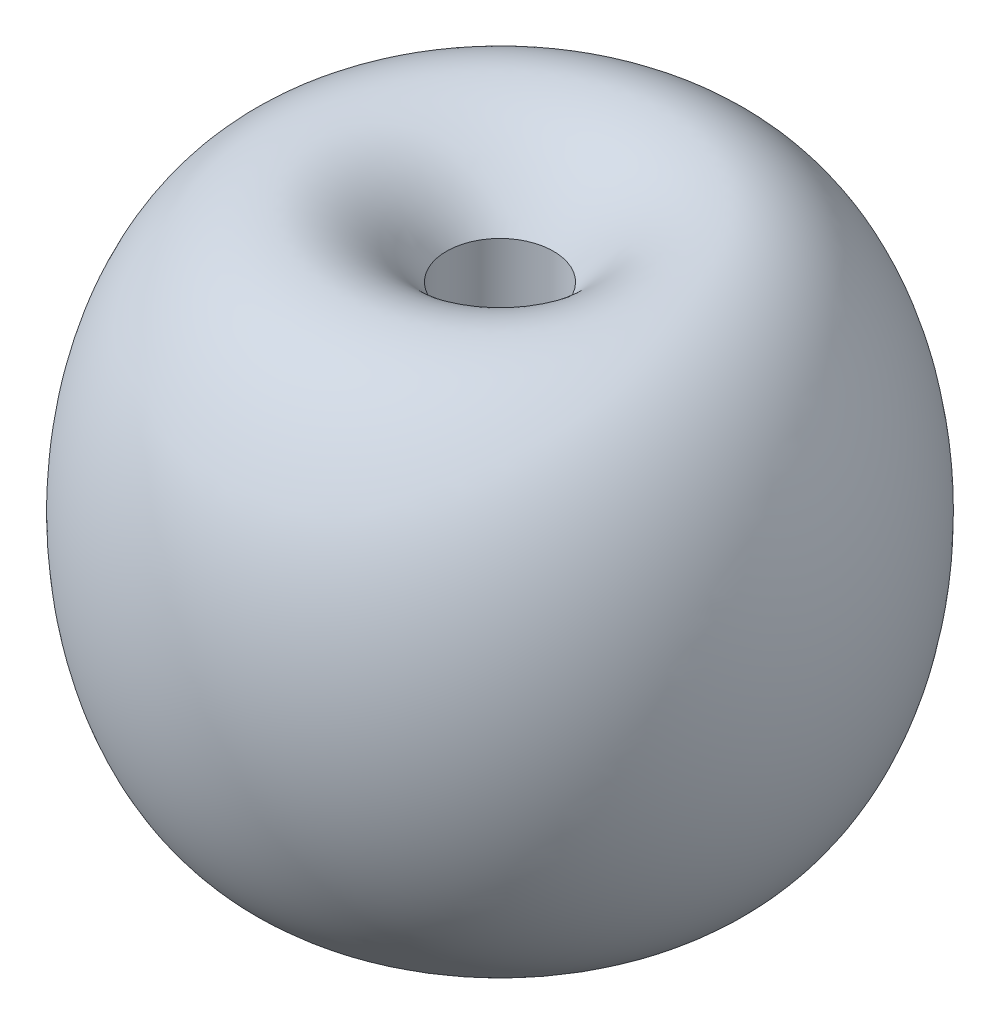
ISO-10303-21;
HEADER;
FILE_DESCRIPTION(('STEP AP214'),'2;1');
FILE_NAME('part.step','',(''),(''),'','','');
FILE_SCHEMA(('AUTOMOTIVE_DESIGN { 1 0 10303 214 1 1 1 1 }'));
ENDSEC;
DATA;
#1=APPLICATION_CONTEXT('core data for automotive mechanical design processes');
#2=APPLICATION_PROTOCOL_DEFINITION('international standard','automotive_design',2000,#1);
#3=PRODUCT_CONTEXT('',#1,'mechanical');
#4=PRODUCT('Part','Part','',(#3));
#5=PRODUCT_RELATED_PRODUCT_CATEGORY('part','',(#4));
#6=PRODUCT_DEFINITION_FORMATION('','',#4);
#7=PRODUCT_DEFINITION_CONTEXT('part definition',#1,'design');
#8=PRODUCT_DEFINITION('design','',#6,#7);
#9=PRODUCT_DEFINITION_SHAPE('','',#8);
#10=(LENGTH_UNIT() NAMED_UNIT(*) SI_UNIT(.MILLI.,.METRE.));
#11=(NAMED_UNIT(*) PLANE_ANGLE_UNIT() SI_UNIT($,.RADIAN.));
#12=(NAMED_UNIT(*) SI_UNIT($,.STERADIAN.) SOLID_ANGLE_UNIT());
#13=UNCERTAINTY_MEASURE_WITH_UNIT(LENGTH_MEASURE(1.E-05),#10,'distance_accuracy_value','');
#14=(GEOMETRIC_REPRESENTATION_CONTEXT(3) GLOBAL_UNCERTAINTY_ASSIGNED_CONTEXT((#13)) GLOBAL_UNIT_ASSIGNED_CONTEXT((#10,
#11,#12)) REPRESENTATION_CONTEXT('',''));
#15=CARTESIAN_POINT('',(0.,0.,0.));
#16=DIRECTION('',(0.,0.,1.));
#17=DIRECTION('',(1.,0.,0.));
#18=AXIS2_PLACEMENT_3D('',#15,#16,#17);
#19=CARTESIAN_POINT('',(0.,30.,0.));
#20=DIRECTION('',(0.,1.,0.));
#21=DIRECTION('',(0.,0.,1.));
#22=AXIS2_PLACEMENT_3D('',#19,#20,#21);
#23=CYLINDRICAL_SURFACE('',#22,5.);
#24=CARTESIAN_POINT('',(0.,-18.6338998124982,0.));
#25=DIRECTION('',(0.,1.,0.));
#26=DIRECTION('',(0.,0.,1.));
#27=AXIS2_PLACEMENT_3D('',#24,#25,#26);
#28=CIRCLE('',#27,5.);
#29=CARTESIAN_POINT('',(0.,-18.6338998124982,5.));
#30=VERTEX_POINT('',#29);
#31=EDGE_CURVE('E49',#30,#30,#28,.T.);
#32=ORIENTED_EDGE('',*,*,#31,.F.);
#33=EDGE_LOOP('',(#32));
#34=FACE_BOUND('',#33,.T.);
#35=CARTESIAN_POINT('',(0.,18.6338998124982,0.));
#36=DIRECTION('',(0.,1.,0.));
#37=DIRECTION('',(0.,0.,1.));
#38=AXIS2_PLACEMENT_3D('',#35,#36,#37);
#39=CIRCLE('',#38,5.);
#40=CARTESIAN_POINT('',(0.,18.6338998124982,5.));
#41=VERTEX_POINT('',#40);
#42=EDGE_CURVE('E10',#41,#41,#39,.T.);
#43=ORIENTED_EDGE('',*,*,#42,.T.);
#44=EDGE_LOOP('',(#43));
#45=FACE_BOUND('',#44,.T.);
#46=ADVANCED_FACE('F42',(#34,#45),#23,.F.);
#47=CARTESIAN_POINT('',(-15.,0.,0.));
#48=DIRECTION('',(0.,0.,1.));
#49=DIRECTION('',(0.,1.,0.));
#50=AXIS2_PLACEMENT_3D('',#47,#48,#49);
#51=ELLIPSE('',#50,25.,15.);
#52=TRIMMED_CURVE('',#51,(PARAMETER_VALUE(4.71238898038469)),
(PARAMETER_VALUE(10.9955742875643)),.T.,.PARAMETER.);
#53=CARTESIAN_POINT('',(0.,30.,0.));
#54=DIRECTION('',(0.,1.,0.));
#55=AXIS1_PLACEMENT('',#53,#54);
#56=SURFACE_OF_REVOLUTION('',#52,#55);
#57=ORIENTED_EDGE('',*,*,#31,.T.);
#58=EDGE_LOOP('',(#57));
#59=FACE_BOUND('',#58,.T.);
#60=ORIENTED_EDGE('',*,*,#42,.F.);
#61=EDGE_LOOP('',(#60));
#62=FACE_BOUND('',#61,.T.);
#63=ADVANCED_FACE('F58',(#59,#62),#56,.F.);
#64=CLOSED_SHELL('',(#46,#63));
#65=MANIFOLD_SOLID_BREP('B2',#64);
#66=ADVANCED_BREP_SHAPE_REPRESENTATION('',(#18,#65),#14);
#67=SHAPE_DEFINITION_REPRESENTATION(#9,#66);
ENDSEC;
END-ISO-10303-21;
